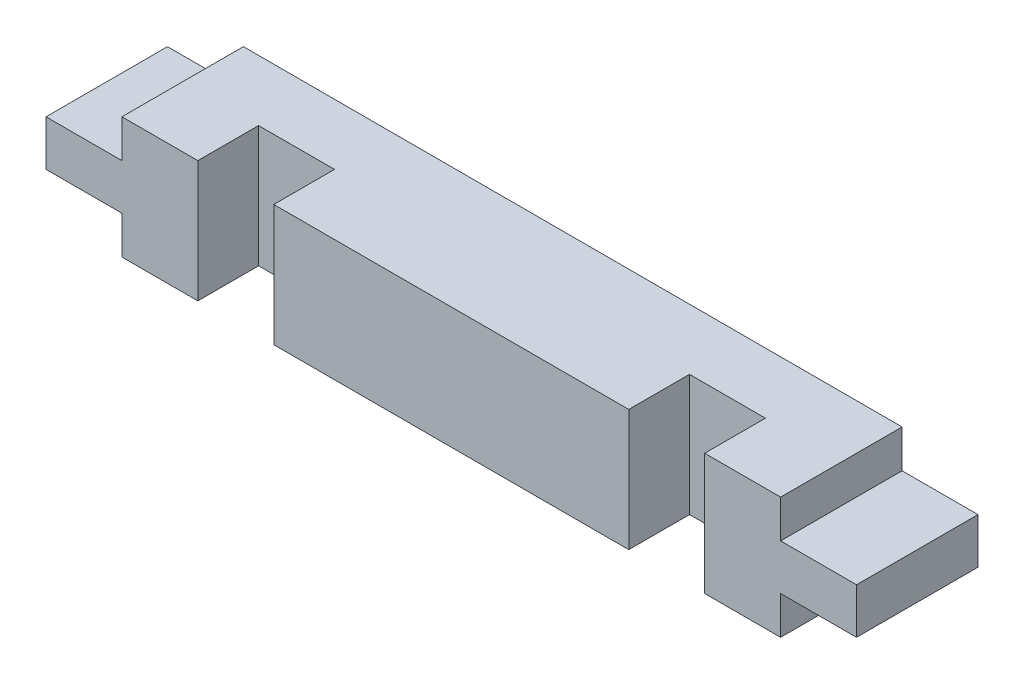
ISO-10303-21;
HEADER;
FILE_DESCRIPTION(('STEP AP214'),'2;1');
FILE_NAME('part.step','',(''),(''),'','','');
FILE_SCHEMA(('AUTOMOTIVE_DESIGN { 1 0 10303 214 1 1 1 1 }'));
ENDSEC;
DATA;
#1=APPLICATION_CONTEXT('core data for automotive mechanical design processes');
#2=APPLICATION_PROTOCOL_DEFINITION('international standard','automotive_design',2000,#1);
#3=PRODUCT_CONTEXT('',#1,'mechanical');
#4=PRODUCT('Part','Part','',(#3));
#5=PRODUCT_RELATED_PRODUCT_CATEGORY('part','',(#4));
#6=PRODUCT_DEFINITION_FORMATION('','',#4);
#7=PRODUCT_DEFINITION_CONTEXT('part definition',#1,'design');
#8=PRODUCT_DEFINITION('design','',#6,#7);
#9=PRODUCT_DEFINITION_SHAPE('','',#8);
#10=(LENGTH_UNIT() NAMED_UNIT(*) SI_UNIT(.MILLI.,.METRE.));
#11=(NAMED_UNIT(*) PLANE_ANGLE_UNIT() SI_UNIT($,.RADIAN.));
#12=(NAMED_UNIT(*) SI_UNIT($,.STERADIAN.) SOLID_ANGLE_UNIT());
#13=UNCERTAINTY_MEASURE_WITH_UNIT(LENGTH_MEASURE(1.E-05),#10,'distance_accuracy_value','');
#14=(GEOMETRIC_REPRESENTATION_CONTEXT(3) GLOBAL_UNCERTAINTY_ASSIGNED_CONTEXT((#13)) GLOBAL_UNIT_ASSIGNED_CONTEXT((#10,
#11,#12)) REPRESENTATION_CONTEXT('',''));
#15=CARTESIAN_POINT('',(0.,0.,0.));
#16=DIRECTION('',(0.,0.,1.));
#17=DIRECTION('',(1.,0.,0.));
#18=AXIS2_PLACEMENT_3D('',#15,#16,#17);
#19=CARTESIAN_POINT('',(0.,0.,8.));
#20=DIRECTION('',(0.,0.,-1.));
#21=DIRECTION('',(-1.,0.,0.));
#22=AXIS2_PLACEMENT_3D('',#19,#20,#21);
#23=PLANE('',#22);
#24=DIRECTION('',(1.,0.,0.));
#25=VECTOR('',#24,1.);
#26=CARTESIAN_POINT('',(48.38,-2.5,8.));
#27=LINE('',#26,#25);
#28=CARTESIAN_POINT('',(5.,-2.5,8.));
#29=VERTEX_POINT('',#28);
#30=CARTESIAN_POINT('',(10.,-2.5,8.));
#31=VERTEX_POINT('',#30);
#32=EDGE_CURVE('E241',#29,#31,#27,.T.);
#33=ORIENTED_EDGE('',*,*,#32,.T.);
#34=DIRECTION('',(0.,-1.,0.));
#35=VECTOR('',#34,1.);
#36=CARTESIAN_POINT('',(10.,-2.5,8.));
#37=LINE('',#36,#35);
#38=CARTESIAN_POINT('',(10.,5.5,8.));
#39=VERTEX_POINT('',#38);
#40=EDGE_CURVE('E177',#39,#31,#37,.T.);
#41=ORIENTED_EDGE('',*,*,#40,.F.);
#42=DIRECTION('',(-1.,0.,0.));
#43=VECTOR('',#42,1.);
#44=CARTESIAN_POINT('',(5.,5.5,8.));
#45=LINE('',#44,#43);
#46=CARTESIAN_POINT('',(5.,5.5,8.));
#47=VERTEX_POINT('',#46);
#48=EDGE_CURVE('E254',#39,#47,#45,.T.);
#49=ORIENTED_EDGE('',*,*,#48,.T.);
#50=DIRECTION('',(0.,-1.,0.));
#51=VECTOR('',#50,1.);
#52=CARTESIAN_POINT('',(5.,3.,8.));
#53=LINE('',#52,#51);
#54=CARTESIAN_POINT('',(5.,3.,8.));
#55=VERTEX_POINT('',#54);
#56=EDGE_CURVE('E258',#47,#55,#53,.T.);
#57=ORIENTED_EDGE('',*,*,#56,.T.);
#58=DIRECTION('',(-1.,0.,0.));
#59=VECTOR('',#58,1.);
#60=CARTESIAN_POINT('',(0.,3.,8.));
#61=LINE('',#60,#59);
#62=CARTESIAN_POINT('',(0.,3.,8.));
#63=VERTEX_POINT('',#62);
#64=EDGE_CURVE('E261',#55,#63,#61,.T.);
#65=ORIENTED_EDGE('',*,*,#64,.T.);
#66=DIRECTION('',(0.,-1.,0.));
#67=VECTOR('',#66,1.);
#68=CARTESIAN_POINT('',(0.,0.,8.));
#69=LINE('',#68,#67);
#70=CARTESIAN_POINT('',(0.,0.,8.));
#71=VERTEX_POINT('',#70);
#72=EDGE_CURVE('E263',#63,#71,#69,.T.);
#73=ORIENTED_EDGE('',*,*,#72,.T.);
#74=DIRECTION('',(1.,0.,0.));
#75=VECTOR('',#74,1.);
#76=CARTESIAN_POINT('',(5.,0.,8.));
#77=LINE('',#76,#75);
#78=CARTESIAN_POINT('',(5.,0.,8.));
#79=VERTEX_POINT('',#78);
#80=EDGE_CURVE('E234',#71,#79,#77,.T.);
#81=ORIENTED_EDGE('',*,*,#80,.T.);
#82=DIRECTION('',(0.,-1.,0.));
#83=VECTOR('',#82,1.);
#84=CARTESIAN_POINT('',(5.,-2.5,8.));
#85=LINE('',#84,#83);
#86=EDGE_CURVE('E237',#79,#29,#85,.T.);
#87=ORIENTED_EDGE('',*,*,#86,.T.);
#88=EDGE_LOOP('',(#33,#41,#49,#57,#65,#73,#81,#87));
#89=FACE_BOUND('',#88,.T.);
#90=ADVANCED_FACE('F35',(#89),#23,.F.);
#91=CARTESIAN_POINT('',(38.38,5.5,8.));
#92=VERTEX_POINT('',#91);
#93=CARTESIAN_POINT('',(15.,5.5,8.));
#94=VERTEX_POINT('',#93);
#95=EDGE_CURVE('E259',#92,#94,#45,.T.);
#96=ORIENTED_EDGE('',*,*,#95,.T.);
#97=DIRECTION('',(0.,1.,0.));
#98=VECTOR('',#97,1.);
#99=CARTESIAN_POINT('',(15.,-2.5,8.));
#100=LINE('',#99,#98);
#101=CARTESIAN_POINT('',(15.,-2.5,8.));
#102=VERTEX_POINT('',#101);
#103=EDGE_CURVE('E191',#102,#94,#100,.T.);
#104=ORIENTED_EDGE('',*,*,#103,.F.);
#105=CARTESIAN_POINT('',(38.38,-2.5,8.));
#106=VERTEX_POINT('',#105);
#107=EDGE_CURVE('E244',#102,#106,#27,.T.);
#108=ORIENTED_EDGE('',*,*,#107,.T.);
#109=DIRECTION('',(0.,-1.,0.));
#110=VECTOR('',#109,1.);
#111=CARTESIAN_POINT('',(38.38,-2.5,8.));
#112=LINE('',#111,#110);
#113=EDGE_CURVE('E224',#92,#106,#112,.T.);
#114=ORIENTED_EDGE('',*,*,#113,.F.);
#115=EDGE_LOOP('',(#96,#104,#108,#114));
#116=FACE_BOUND('',#115,.T.);
#117=ADVANCED_FACE('F345',(#116),#23,.F.);
#118=CARTESIAN_POINT('',(5.,0.,8.));
#119=DIRECTION('',(0.,1.,0.));
#120=DIRECTION('',(0.,0.,1.));
#121=AXIS2_PLACEMENT_3D('',#118,#119,#120);
#122=PLANE('',#121);
#123=DIRECTION('',(1.,0.,0.));
#124=VECTOR('',#123,1.);
#125=CARTESIAN_POINT('',(5.,0.,0.));
#126=LINE('',#125,#124);
#127=CARTESIAN_POINT('',(0.,0.,0.));
#128=VERTEX_POINT('',#127);
#129=CARTESIAN_POINT('',(5.,0.,0.));
#130=VERTEX_POINT('',#129);
#131=EDGE_CURVE('E205',#128,#130,#126,.T.);
#132=ORIENTED_EDGE('',*,*,#131,.T.);
#133=DIRECTION('',(0.,0.,-1.));
#134=VECTOR('',#133,1.);
#135=CARTESIAN_POINT('',(5.,0.,8.));
#136=LINE('',#135,#134);
#137=EDGE_CURVE('E11',#79,#130,#136,.T.);
#138=ORIENTED_EDGE('',*,*,#137,.F.);
#139=ORIENTED_EDGE('',*,*,#80,.F.);
#140=DIRECTION('',(0.,0.,-1.));
#141=VECTOR('',#140,1.);
#142=CARTESIAN_POINT('',(0.,0.,8.));
#143=LINE('',#142,#141);
#144=EDGE_CURVE('E265',#71,#128,#143,.T.);
#145=ORIENTED_EDGE('',*,*,#144,.T.);
#146=EDGE_LOOP('',(#132,#138,#139,#145));
#147=FACE_BOUND('',#146,.T.);
#148=ADVANCED_FACE('F37',(#147),#122,.F.);
#149=CARTESIAN_POINT('',(5.,-2.5,8.));
#150=DIRECTION('',(1.,0.,0.));
#151=DIRECTION('',(0.,0.,-1.));
#152=AXIS2_PLACEMENT_3D('',#149,#150,#151);
#153=PLANE('',#152);
#154=DIRECTION('',(0.,-1.,0.));
#155=VECTOR('',#154,1.);
#156=CARTESIAN_POINT('',(5.,-2.5,0.));
#157=LINE('',#156,#155);
#158=CARTESIAN_POINT('',(5.,-2.5,0.));
#159=VERTEX_POINT('',#158);
#160=EDGE_CURVE('E268',#130,#159,#157,.T.);
#161=ORIENTED_EDGE('',*,*,#160,.T.);
#162=DIRECTION('',(0.,0.,-1.));
#163=VECTOR('',#162,1.);
#164=CARTESIAN_POINT('',(5.,-2.5,8.));
#165=LINE('',#164,#163);
#166=EDGE_CURVE('E43',#29,#159,#165,.T.);
#167=ORIENTED_EDGE('',*,*,#166,.F.);
#168=ORIENTED_EDGE('',*,*,#86,.F.);
#169=ORIENTED_EDGE('',*,*,#137,.T.);
#170=EDGE_LOOP('',(#161,#167,#168,#169));
#171=FACE_BOUND('',#170,.T.);
#172=ADVANCED_FACE('F378',(#171),#153,.F.);
#173=CARTESIAN_POINT('',(48.38,-2.5,8.));
#174=DIRECTION('',(0.,1.,0.));
#175=DIRECTION('',(0.,0.,1.));
#176=AXIS2_PLACEMENT_3D('',#173,#174,#175);
#177=PLANE('',#176);
#178=DIRECTION('',(1.,0.,0.));
#179=VECTOR('',#178,1.);
#180=CARTESIAN_POINT('',(10.,-2.5,4.));
#181=LINE('',#180,#179);
#182=CARTESIAN_POINT('',(10.,-2.5,4.));
#183=VERTEX_POINT('',#182);
#184=CARTESIAN_POINT('',(15.,-2.5,4.));
#185=VERTEX_POINT('',#184);
#186=EDGE_CURVE('E188',#183,#185,#181,.T.);
#187=ORIENTED_EDGE('',*,*,#186,.F.);
#188=DIRECTION('',(0.,0.,1.));
#189=VECTOR('',#188,1.);
#190=CARTESIAN_POINT('',(10.,-2.5,4.));
#191=LINE('',#190,#189);
#192=EDGE_CURVE('E171',#183,#31,#191,.T.);
#193=ORIENTED_EDGE('',*,*,#192,.T.);
#194=ORIENTED_EDGE('',*,*,#32,.F.);
#195=ORIENTED_EDGE('',*,*,#166,.T.);
#196=DIRECTION('',(1.,0.,0.));
#197=VECTOR('',#196,1.);
#198=CARTESIAN_POINT('',(48.38,-2.5,0.));
#199=LINE('',#198,#197);
#200=CARTESIAN_POINT('',(48.38,-2.5,0.));
#201=VERTEX_POINT('',#200);
#202=EDGE_CURVE('E270',#159,#201,#199,.T.);
#203=ORIENTED_EDGE('',*,*,#202,.T.);
#204=DIRECTION('',(0.,0.,-1.));
#205=VECTOR('',#204,1.);
#206=CARTESIAN_POINT('',(48.38,-2.5,8.));
#207=LINE('',#206,#205);
#208=CARTESIAN_POINT('',(48.38,-2.5,8.));
#209=VERTEX_POINT('',#208);
#210=EDGE_CURVE('E315',#209,#201,#207,.T.);
#211=ORIENTED_EDGE('',*,*,#210,.F.);
#212=CARTESIAN_POINT('',(43.38,-2.5,8.));
#213=VERTEX_POINT('',#212);
#214=EDGE_CURVE('E240',#213,#209,#27,.T.);
#215=ORIENTED_EDGE('',*,*,#214,.F.);
#216=DIRECTION('',(0.,0.,1.));
#217=VECTOR('',#216,1.);
#218=CARTESIAN_POINT('',(43.38,-2.5,4.));
#219=LINE('',#218,#217);
#220=CARTESIAN_POINT('',(43.38,-2.5,4.));
#221=VERTEX_POINT('',#220);
#222=EDGE_CURVE('E50',#221,#213,#219,.T.);
#223=ORIENTED_EDGE('',*,*,#222,.F.);
#224=DIRECTION('',(1.,0.,0.));
#225=VECTOR('',#224,1.);
#226=CARTESIAN_POINT('',(38.38,-2.5,4.));
#227=LINE('',#226,#225);
#228=CARTESIAN_POINT('',(38.38,-2.5,4.));
#229=VERTEX_POINT('',#228);
#230=EDGE_CURVE('E213',#229,#221,#227,.T.);
#231=ORIENTED_EDGE('',*,*,#230,.F.);
#232=DIRECTION('',(0.,0.,1.));
#233=VECTOR('',#232,1.);
#234=CARTESIAN_POINT('',(38.38,-2.5,4.));
#235=LINE('',#234,#233);
#236=EDGE_CURVE('E223',#229,#106,#235,.T.);
#237=ORIENTED_EDGE('',*,*,#236,.T.);
#238=ORIENTED_EDGE('',*,*,#107,.F.);
#239=DIRECTION('',(0.,0.,1.));
#240=VECTOR('',#239,1.);
#241=CARTESIAN_POINT('',(15.,-2.5,4.));
#242=LINE('',#241,#240);
#243=EDGE_CURVE('E58',#185,#102,#242,.T.);
#244=ORIENTED_EDGE('',*,*,#243,.F.);
#245=EDGE_LOOP('',(#187,#193,#194,#195,#203,#211,#215,#223,#231,#237,#238,#244));
#246=FACE_BOUND('',#245,.T.);
#247=ADVANCED_FACE('F193',(#246),#177,.F.);
#248=CARTESIAN_POINT('',(48.38,0.,8.));
#249=DIRECTION('',(-1.,0.,0.));
#250=DIRECTION('',(0.,-1.,0.));
#251=AXIS2_PLACEMENT_3D('',#248,#249,#250);
#252=PLANE('',#251);
#253=DIRECTION('',(0.,1.,0.));
#254=VECTOR('',#253,1.);
#255=CARTESIAN_POINT('',(48.38,0.,0.));
#256=LINE('',#255,#254);
#257=CARTESIAN_POINT('',(48.38,0.,0.));
#258=VERTEX_POINT('',#257);
#259=EDGE_CURVE('E272',#201,#258,#256,.T.);
#260=ORIENTED_EDGE('',*,*,#259,.T.);
#261=DIRECTION('',(0.,0.,-1.));
#262=VECTOR('',#261,1.);
#263=CARTESIAN_POINT('',(48.38,0.,8.));
#264=LINE('',#263,#262);
#265=CARTESIAN_POINT('',(48.38,0.,8.));
#266=VERTEX_POINT('',#265);
#267=EDGE_CURVE('E312',#266,#258,#264,.T.);
#268=ORIENTED_EDGE('',*,*,#267,.F.);
#269=DIRECTION('',(0.,1.,0.));
#270=VECTOR('',#269,1.);
#271=CARTESIAN_POINT('',(48.38,0.,8.));
#272=LINE('',#271,#270);
#273=EDGE_CURVE('E243',#209,#266,#272,.T.);
#274=ORIENTED_EDGE('',*,*,#273,.F.);
#275=ORIENTED_EDGE('',*,*,#210,.T.);
#276=EDGE_LOOP('',(#260,#268,#274,#275));
#277=FACE_BOUND('',#276,.T.);
#278=ADVANCED_FACE('F330',(#277),#252,.F.);
#279=CARTESIAN_POINT('',(53.38,0.,8.));
#280=DIRECTION('',(0.,1.,0.));
#281=DIRECTION('',(-1.,0.,0.));
#282=AXIS2_PLACEMENT_3D('',#279,#280,#281);
#283=PLANE('',#282);
#284=DIRECTION('',(1.,0.,0.));
#285=VECTOR('',#284,1.);
#286=CARTESIAN_POINT('',(53.38,0.,0.));
#287=LINE('',#286,#285);
#288=CARTESIAN_POINT('',(53.38,0.,0.));
#289=VERTEX_POINT('',#288);
#290=EDGE_CURVE('E274',#258,#289,#287,.T.);
#291=ORIENTED_EDGE('',*,*,#290,.T.);
#292=DIRECTION('',(0.,0.,-1.));
#293=VECTOR('',#292,1.);
#294=CARTESIAN_POINT('',(53.38,0.,8.));
#295=LINE('',#294,#293);
#296=CARTESIAN_POINT('',(53.38,0.,8.));
#297=VERTEX_POINT('',#296);
#298=EDGE_CURVE('E309',#297,#289,#295,.T.);
#299=ORIENTED_EDGE('',*,*,#298,.F.);
#300=DIRECTION('',(1.,0.,0.));
#301=VECTOR('',#300,1.);
#302=CARTESIAN_POINT('',(53.38,0.,8.));
#303=LINE('',#302,#301);
#304=EDGE_CURVE('E246',#266,#297,#303,.T.);
#305=ORIENTED_EDGE('',*,*,#304,.F.);
#306=ORIENTED_EDGE('',*,*,#267,.T.);
#307=EDGE_LOOP('',(#291,#299,#305,#306));
#308=FACE_BOUND('',#307,.T.);
#309=ADVANCED_FACE('F334',(#308),#283,.F.);
#310=CARTESIAN_POINT('',(53.38,3.,8.));
#311=DIRECTION('',(-1.,0.,0.));
#312=DIRECTION('',(0.,-1.,0.));
#313=AXIS2_PLACEMENT_3D('',#310,#311,#312);
#314=PLANE('',#313);
#315=DIRECTION('',(0.,1.,0.));
#316=VECTOR('',#315,1.);
#317=CARTESIAN_POINT('',(53.38,3.,0.));
#318=LINE('',#317,#316);
#319=CARTESIAN_POINT('',(53.38,3.,0.));
#320=VERTEX_POINT('',#319);
#321=EDGE_CURVE('E276',#289,#320,#318,.T.);
#322=ORIENTED_EDGE('',*,*,#321,.T.);
#323=DIRECTION('',(0.,0.,-1.));
#324=VECTOR('',#323,1.);
#325=CARTESIAN_POINT('',(53.38,3.,8.));
#326=LINE('',#325,#324);
#327=CARTESIAN_POINT('',(53.38,3.,8.));
#328=VERTEX_POINT('',#327);
#329=EDGE_CURVE('E306',#328,#320,#326,.T.);
#330=ORIENTED_EDGE('',*,*,#329,.F.);
#331=DIRECTION('',(0.,1.,0.));
#332=VECTOR('',#331,1.);
#333=CARTESIAN_POINT('',(53.38,3.,8.));
#334=LINE('',#333,#332);
#335=EDGE_CURVE('E248',#297,#328,#334,.T.);
#336=ORIENTED_EDGE('',*,*,#335,.F.);
#337=ORIENTED_EDGE('',*,*,#298,.T.);
#338=EDGE_LOOP('',(#322,#330,#336,#337));
#339=FACE_BOUND('',#338,.T.);
#340=ADVANCED_FACE('F414',(#339),#314,.F.);
#341=CARTESIAN_POINT('',(48.38,3.,8.));
#342=DIRECTION('',(0.,-1.,0.));
#343=DIRECTION('',(0.,0.,-1.));
#344=AXIS2_PLACEMENT_3D('',#341,#342,#343);
#345=PLANE('',#344);
#346=DIRECTION('',(-1.,0.,0.));
#347=VECTOR('',#346,1.);
#348=CARTESIAN_POINT('',(48.38,3.,0.));
#349=LINE('',#348,#347);
#350=CARTESIAN_POINT('',(48.38,3.,0.));
#351=VERTEX_POINT('',#350);
#352=EDGE_CURVE('E278',#320,#351,#349,.T.);
#353=ORIENTED_EDGE('',*,*,#352,.T.);
#354=DIRECTION('',(0.,0.,-1.));
#355=VECTOR('',#354,1.);
#356=CARTESIAN_POINT('',(48.38,3.,8.));
#357=LINE('',#356,#355);
#358=CARTESIAN_POINT('',(48.38,3.,8.));
#359=VERTEX_POINT('',#358);
#360=EDGE_CURVE('E303',#359,#351,#357,.T.);
#361=ORIENTED_EDGE('',*,*,#360,.F.);
#362=DIRECTION('',(-1.,0.,0.));
#363=VECTOR('',#362,1.);
#364=CARTESIAN_POINT('',(48.38,3.,8.));
#365=LINE('',#364,#363);
#366=EDGE_CURVE('E250',#328,#359,#365,.T.);
#367=ORIENTED_EDGE('',*,*,#366,.F.);
#368=ORIENTED_EDGE('',*,*,#329,.T.);
#369=EDGE_LOOP('',(#353,#361,#367,#368));
#370=FACE_BOUND('',#369,.T.);
#371=ADVANCED_FACE('F410',(#370),#345,.F.);
#372=CARTESIAN_POINT('',(48.38,5.5,8.));
#373=DIRECTION('',(-1.,0.,0.));
#374=DIRECTION('',(0.,-1.,0.));
#375=AXIS2_PLACEMENT_3D('',#372,#373,#374);
#376=PLANE('',#375);
#377=DIRECTION('',(0.,1.,0.));
#378=VECTOR('',#377,1.);
#379=CARTESIAN_POINT('',(48.38,5.5,0.));
#380=LINE('',#379,#378);
#381=CARTESIAN_POINT('',(48.38,5.5,0.));
#382=VERTEX_POINT('',#381);
#383=EDGE_CURVE('E280',#351,#382,#380,.T.);
#384=ORIENTED_EDGE('',*,*,#383,.T.);
#385=DIRECTION('',(0.,0.,-1.));
#386=VECTOR('',#385,1.);
#387=CARTESIAN_POINT('',(48.38,5.5,8.));
#388=LINE('',#387,#386);
#389=CARTESIAN_POINT('',(48.38,5.5,8.));
#390=VERTEX_POINT('',#389);
#391=EDGE_CURVE('E300',#390,#382,#388,.T.);
#392=ORIENTED_EDGE('',*,*,#391,.F.);
#393=DIRECTION('',(0.,1.,0.));
#394=VECTOR('',#393,1.);
#395=CARTESIAN_POINT('',(48.38,5.5,8.));
#396=LINE('',#395,#394);
#397=EDGE_CURVE('E252',#359,#390,#396,.T.);
#398=ORIENTED_EDGE('',*,*,#397,.F.);
#399=ORIENTED_EDGE('',*,*,#360,.T.);
#400=EDGE_LOOP('',(#384,#392,#398,#399));
#401=FACE_BOUND('',#400,.T.);
#402=ADVANCED_FACE('F407',(#401),#376,.F.);
#403=CARTESIAN_POINT('',(5.,5.5,8.));
#404=DIRECTION('',(0.,-1.,0.));
#405=DIRECTION('',(0.,0.,-1.));
#406=AXIS2_PLACEMENT_3D('',#403,#404,#405);
#407=PLANE('',#406);
#408=ORIENTED_EDGE('',*,*,#48,.F.);
#409=DIRECTION('',(0.,0.,1.));
#410=VECTOR('',#409,1.);
#411=CARTESIAN_POINT('',(10.,5.5,4.));
#412=LINE('',#411,#410);
#413=CARTESIAN_POINT('',(10.,5.5,4.));
#414=VERTEX_POINT('',#413);
#415=EDGE_CURVE('E203',#414,#39,#412,.T.);
#416=ORIENTED_EDGE('',*,*,#415,.F.);
#417=DIRECTION('',(-1.,0.,0.));
#418=VECTOR('',#417,1.);
#419=CARTESIAN_POINT('',(10.,5.5,4.));
#420=LINE('',#419,#418);
#421=CARTESIAN_POINT('',(15.,5.5,4.));
#422=VERTEX_POINT('',#421);
#423=EDGE_CURVE('E182',#422,#414,#420,.T.);
#424=ORIENTED_EDGE('',*,*,#423,.F.);
#425=DIRECTION('',(0.,0.,1.));
#426=VECTOR('',#425,1.);
#427=CARTESIAN_POINT('',(15.,5.5,4.));
#428=LINE('',#427,#426);
#429=EDGE_CURVE('E206',#422,#94,#428,.T.);
#430=ORIENTED_EDGE('',*,*,#429,.T.);
#431=ORIENTED_EDGE('',*,*,#95,.F.);
#432=DIRECTION('',(0.,0.,1.));
#433=VECTOR('',#432,1.);
#434=CARTESIAN_POINT('',(38.38,5.5,4.));
#435=LINE('',#434,#433);
#436=CARTESIAN_POINT('',(38.38,5.5,4.));
#437=VERTEX_POINT('',#436);
#438=EDGE_CURVE('E201',#437,#92,#435,.T.);
#439=ORIENTED_EDGE('',*,*,#438,.F.);
#440=DIRECTION('',(-1.,0.,0.));
#441=VECTOR('',#440,1.);
#442=CARTESIAN_POINT('',(38.38,5.5,4.));
#443=LINE('',#442,#441);
#444=CARTESIAN_POINT('',(43.38,5.5,4.));
#445=VERTEX_POINT('',#444);
#446=EDGE_CURVE('E220',#445,#437,#443,.T.);
#447=ORIENTED_EDGE('',*,*,#446,.F.);
#448=DIRECTION('',(0.,0.,1.));
#449=VECTOR('',#448,1.);
#450=CARTESIAN_POINT('',(43.38,5.5,4.));
#451=LINE('',#450,#449);
#452=CARTESIAN_POINT('',(43.38,5.5,8.));
#453=VERTEX_POINT('',#452);
#454=EDGE_CURVE('E228',#445,#453,#451,.T.);
#455=ORIENTED_EDGE('',*,*,#454,.T.);
#456=EDGE_CURVE('E255',#390,#453,#45,.T.);
#457=ORIENTED_EDGE('',*,*,#456,.F.);
#458=ORIENTED_EDGE('',*,*,#391,.T.);
#459=DIRECTION('',(-1.,0.,0.));
#460=VECTOR('',#459,1.);
#461=CARTESIAN_POINT('',(5.,5.5,0.));
#462=LINE('',#461,#460);
#463=CARTESIAN_POINT('',(5.,5.5,0.));
#464=VERTEX_POINT('',#463);
#465=EDGE_CURVE('E282',#382,#464,#462,.T.);
#466=ORIENTED_EDGE('',*,*,#465,.T.);
#467=DIRECTION('',(0.,0.,-1.));
#468=VECTOR('',#467,1.);
#469=CARTESIAN_POINT('',(5.,5.5,8.));
#470=LINE('',#469,#468);
#471=EDGE_CURVE('E297',#47,#464,#470,.T.);
#472=ORIENTED_EDGE('',*,*,#471,.F.);
#473=EDGE_LOOP('',(#408,#416,#424,#430,#431,#439,#447,#455,#457,#458,#466,#472));
#474=FACE_BOUND('',#473,.T.);
#475=ADVANCED_FACE('F356',(#474),#407,.F.);
#476=CARTESIAN_POINT('',(5.,3.,8.));
#477=DIRECTION('',(1.,0.,0.));
#478=DIRECTION('',(0.,1.,0.));
#479=AXIS2_PLACEMENT_3D('',#476,#477,#478);
#480=PLANE('',#479);
#481=DIRECTION('',(0.,-1.,0.));
#482=VECTOR('',#481,1.);
#483=CARTESIAN_POINT('',(5.,3.,0.));
#484=LINE('',#483,#482);
#485=CARTESIAN_POINT('',(5.,3.,0.));
#486=VERTEX_POINT('',#485);
#487=EDGE_CURVE('E284',#464,#486,#484,.T.);
#488=ORIENTED_EDGE('',*,*,#487,.T.);
#489=DIRECTION('',(0.,0.,-1.));
#490=VECTOR('',#489,1.);
#491=CARTESIAN_POINT('',(5.,3.,8.));
#492=LINE('',#491,#490);
#493=EDGE_CURVE('E294',#55,#486,#492,.T.);
#494=ORIENTED_EDGE('',*,*,#493,.F.);
#495=ORIENTED_EDGE('',*,*,#56,.F.);
#496=ORIENTED_EDGE('',*,*,#471,.T.);
#497=EDGE_LOOP('',(#488,#494,#495,#496));
#498=FACE_BOUND('',#497,.T.);
#499=ADVANCED_FACE('F364',(#498),#480,.F.);
#500=CARTESIAN_POINT('',(0.,3.,8.));
#501=DIRECTION('',(0.,-1.,0.));
#502=DIRECTION('',(0.,0.,-1.));
#503=AXIS2_PLACEMENT_3D('',#500,#501,#502);
#504=PLANE('',#503);
#505=DIRECTION('',(-1.,0.,0.));
#506=VECTOR('',#505,1.);
#507=CARTESIAN_POINT('',(0.,3.,0.));
#508=LINE('',#507,#506);
#509=CARTESIAN_POINT('',(0.,3.,0.));
#510=VERTEX_POINT('',#509);
#511=EDGE_CURVE('E286',#486,#510,#508,.T.);
#512=ORIENTED_EDGE('',*,*,#511,.T.);
#513=DIRECTION('',(0.,0.,-1.));
#514=VECTOR('',#513,1.);
#515=CARTESIAN_POINT('',(0.,3.,8.));
#516=LINE('',#515,#514);
#517=EDGE_CURVE('E291',#63,#510,#516,.T.);
#518=ORIENTED_EDGE('',*,*,#517,.F.);
#519=ORIENTED_EDGE('',*,*,#64,.F.);
#520=ORIENTED_EDGE('',*,*,#493,.T.);
#521=EDGE_LOOP('',(#512,#518,#519,#520));
#522=FACE_BOUND('',#521,.T.);
#523=ADVANCED_FACE('F369',(#522),#504,.F.);
#524=CARTESIAN_POINT('',(0.,0.,8.));
#525=DIRECTION('',(1.,0.,0.));
#526=DIRECTION('',(0.,0.,-1.));
#527=AXIS2_PLACEMENT_3D('',#524,#525,#526);
#528=PLANE('',#527);
#529=DIRECTION('',(0.,-1.,0.));
#530=VECTOR('',#529,1.);
#531=CARTESIAN_POINT('',(0.,0.,0.));
#532=LINE('',#531,#530);
#533=EDGE_CURVE('E238',#510,#128,#532,.T.);
#534=ORIENTED_EDGE('',*,*,#533,.T.);
#535=ORIENTED_EDGE('',*,*,#144,.F.);
#536=ORIENTED_EDGE('',*,*,#72,.F.);
#537=ORIENTED_EDGE('',*,*,#517,.T.);
#538=EDGE_LOOP('',(#534,#535,#536,#537));
#539=FACE_BOUND('',#538,.T.);
#540=ADVANCED_FACE('F375',(#539),#528,.F.);
#541=ORIENTED_EDGE('',*,*,#456,.T.);
#542=DIRECTION('',(0.,1.,0.));
#543=VECTOR('',#542,1.);
#544=CARTESIAN_POINT('',(43.38,-2.5,8.));
#545=LINE('',#544,#543);
#546=EDGE_CURVE('E214',#213,#453,#545,.T.);
#547=ORIENTED_EDGE('',*,*,#546,.F.);
#548=ORIENTED_EDGE('',*,*,#214,.T.);
#549=ORIENTED_EDGE('',*,*,#273,.T.);
#550=ORIENTED_EDGE('',*,*,#304,.T.);
#551=ORIENTED_EDGE('',*,*,#335,.T.);
#552=ORIENTED_EDGE('',*,*,#366,.T.);
#553=ORIENTED_EDGE('',*,*,#397,.T.);
#554=EDGE_LOOP('',(#541,#547,#548,#549,#550,#551,#552,#553));
#555=FACE_BOUND('',#554,.T.);
#556=ADVANCED_FACE('F338',(#555),#23,.F.);
#557=CARTESIAN_POINT('',(0.,0.,0.));
#558=DIRECTION('',(0.,0.,-1.));
#559=DIRECTION('',(-1.,0.,0.));
#560=AXIS2_PLACEMENT_3D('',#557,#558,#559);
#561=PLANE('',#560);
#562=ORIENTED_EDGE('',*,*,#131,.F.);
#563=ORIENTED_EDGE('',*,*,#533,.F.);
#564=ORIENTED_EDGE('',*,*,#511,.F.);
#565=ORIENTED_EDGE('',*,*,#487,.F.);
#566=ORIENTED_EDGE('',*,*,#465,.F.);
#567=ORIENTED_EDGE('',*,*,#383,.F.);
#568=ORIENTED_EDGE('',*,*,#352,.F.);
#569=ORIENTED_EDGE('',*,*,#321,.F.);
#570=ORIENTED_EDGE('',*,*,#290,.F.);
#571=ORIENTED_EDGE('',*,*,#259,.F.);
#572=ORIENTED_EDGE('',*,*,#202,.F.);
#573=ORIENTED_EDGE('',*,*,#160,.F.);
#574=EDGE_LOOP('',(#562,#563,#564,#565,#566,#567,#568,#569,#570,#571,#572,#573));
#575=FACE_BOUND('',#574,.T.);
#576=ADVANCED_FACE('F325',(#575),#561,.T.);
#577=CARTESIAN_POINT('',(38.38,-2.5,4.));
#578=DIRECTION('',(-1.,0.,0.));
#579=DIRECTION('',(0.,0.,1.));
#580=AXIS2_PLACEMENT_3D('',#577,#578,#579);
#581=PLANE('',#580);
#582=ORIENTED_EDGE('',*,*,#113,.T.);
#583=ORIENTED_EDGE('',*,*,#236,.F.);
#584=DIRECTION('',(0.,-1.,0.));
#585=VECTOR('',#584,1.);
#586=CARTESIAN_POINT('',(38.38,-2.5,4.));
#587=LINE('',#586,#585);
#588=EDGE_CURVE('E210',#437,#229,#587,.T.);
#589=ORIENTED_EDGE('',*,*,#588,.F.);
#590=ORIENTED_EDGE('',*,*,#438,.T.);
#591=EDGE_LOOP('',(#582,#583,#589,#590));
#592=FACE_BOUND('',#591,.T.);
#593=ADVANCED_FACE('F349',(#592),#581,.F.);
#594=CARTESIAN_POINT('',(43.38,-2.5,4.));
#595=DIRECTION('',(1.,0.,0.));
#596=DIRECTION('',(0.,0.,-1.));
#597=AXIS2_PLACEMENT_3D('',#594,#595,#596);
#598=PLANE('',#597);
#599=ORIENTED_EDGE('',*,*,#546,.T.);
#600=ORIENTED_EDGE('',*,*,#454,.F.);
#601=DIRECTION('',(0.,1.,0.));
#602=VECTOR('',#601,1.);
#603=CARTESIAN_POINT('',(43.38,-2.5,4.));
#604=LINE('',#603,#602);
#605=EDGE_CURVE('E217',#221,#445,#604,.T.);
#606=ORIENTED_EDGE('',*,*,#605,.F.);
#607=ORIENTED_EDGE('',*,*,#222,.T.);
#608=EDGE_LOOP('',(#599,#600,#606,#607));
#609=FACE_BOUND('',#608,.T.);
#610=ADVANCED_FACE('F513',(#609),#598,.F.);
#611=CARTESIAN_POINT('',(0.,0.,4.));
#612=DIRECTION('',(0.,0.,-1.));
#613=DIRECTION('',(-1.,0.,0.));
#614=AXIS2_PLACEMENT_3D('',#611,#612,#613);
#615=PLANE('',#614);
#616=ORIENTED_EDGE('',*,*,#588,.T.);
#617=ORIENTED_EDGE('',*,*,#230,.T.);
#618=ORIENTED_EDGE('',*,*,#605,.T.);
#619=ORIENTED_EDGE('',*,*,#446,.T.);
#620=EDGE_LOOP('',(#616,#617,#618,#619));
#621=FACE_BOUND('',#620,.T.);
#622=ADVANCED_FACE('F351',(#621),#615,.F.);
#623=CARTESIAN_POINT('',(10.,-2.5,4.));
#624=DIRECTION('',(-1.,0.,0.));
#625=DIRECTION('',(0.,0.,1.));
#626=AXIS2_PLACEMENT_3D('',#623,#624,#625);
#627=PLANE('',#626);
#628=ORIENTED_EDGE('',*,*,#40,.T.);
#629=ORIENTED_EDGE('',*,*,#192,.F.);
#630=DIRECTION('',(0.,-1.,0.));
#631=VECTOR('',#630,1.);
#632=CARTESIAN_POINT('',(10.,-2.5,4.));
#633=LINE('',#632,#631);
#634=EDGE_CURVE('E174',#414,#183,#633,.T.);
#635=ORIENTED_EDGE('',*,*,#634,.F.);
#636=ORIENTED_EDGE('',*,*,#415,.T.);
#637=EDGE_LOOP('',(#628,#629,#635,#636));
#638=FACE_BOUND('',#637,.T.);
#639=ADVANCED_FACE('F173',(#638),#627,.F.);
#640=CARTESIAN_POINT('',(15.,-2.5,4.));
#641=DIRECTION('',(1.,0.,0.));
#642=DIRECTION('',(0.,0.,-1.));
#643=AXIS2_PLACEMENT_3D('',#640,#641,#642);
#644=PLANE('',#643);
#645=ORIENTED_EDGE('',*,*,#103,.T.);
#646=ORIENTED_EDGE('',*,*,#429,.F.);
#647=DIRECTION('',(0.,1.,0.));
#648=VECTOR('',#647,1.);
#649=CARTESIAN_POINT('',(15.,-2.5,4.));
#650=LINE('',#649,#648);
#651=EDGE_CURVE('E195',#185,#422,#650,.T.);
#652=ORIENTED_EDGE('',*,*,#651,.F.);
#653=ORIENTED_EDGE('',*,*,#243,.T.);
#654=EDGE_LOOP('',(#645,#646,#652,#653));
#655=FACE_BOUND('',#654,.T.);
#656=ADVANCED_FACE('F534',(#655),#644,.F.);
#657=CARTESIAN_POINT('',(0.,0.,4.));
#658=DIRECTION('',(0.,0.,-1.));
#659=DIRECTION('',(-1.,0.,0.));
#660=AXIS2_PLACEMENT_3D('',#657,#658,#659);
#661=PLANE('',#660);
#662=ORIENTED_EDGE('',*,*,#634,.T.);
#663=ORIENTED_EDGE('',*,*,#186,.T.);
#664=ORIENTED_EDGE('',*,*,#651,.T.);
#665=ORIENTED_EDGE('',*,*,#423,.T.);
#666=EDGE_LOOP('',(#662,#663,#664,#665));
#667=FACE_BOUND('',#666,.T.);
#668=ADVANCED_FACE('F186',(#667),#661,.F.);
#669=CLOSED_SHELL('',(#90,#117,#148,#172,#247,#278,#309,#340,#371,#402,#475,#499,#523,#540,#556,
#576,#593,#610,#622,#639,#656,#668));
#670=MANIFOLD_SOLID_BREP('B2',#669);
#671=ADVANCED_BREP_SHAPE_REPRESENTATION('',(#18,#670),#14);
#672=SHAPE_DEFINITION_REPRESENTATION(#9,#671);
ENDSEC;
END-ISO-10303-21;
